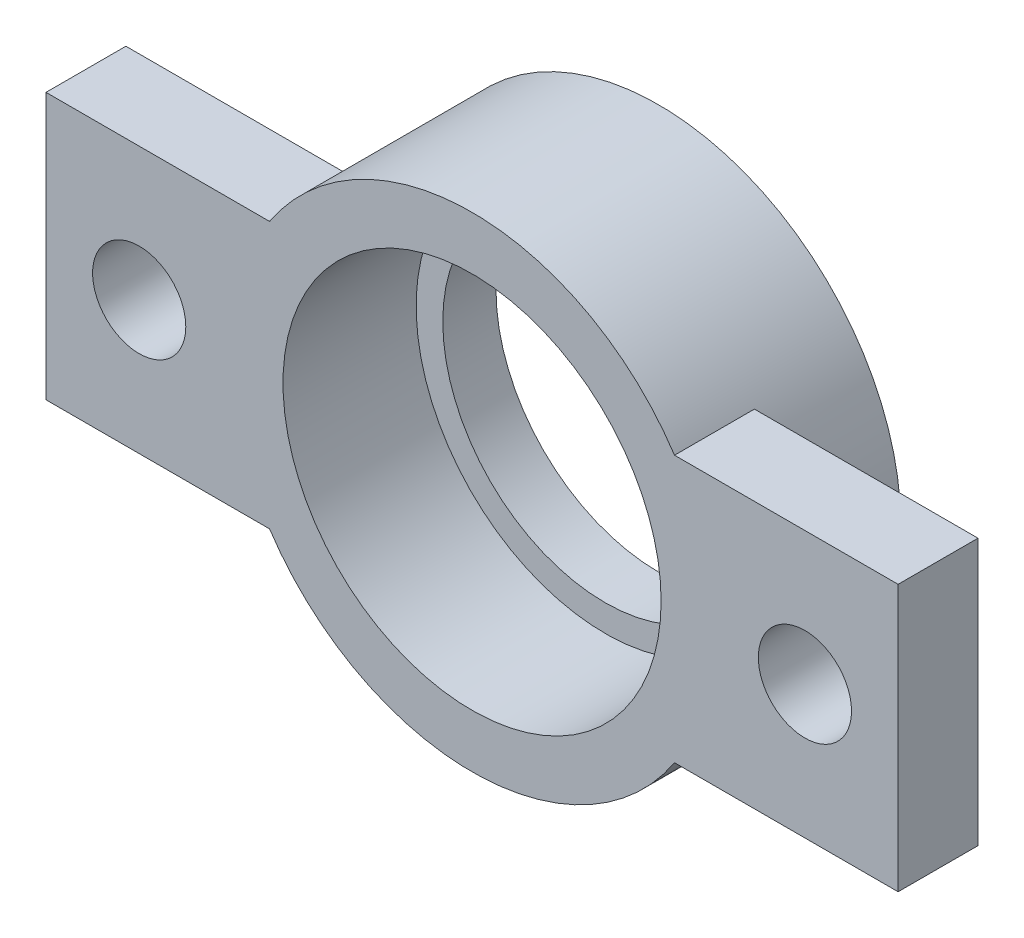
ISO-10303-21;
HEADER;
FILE_DESCRIPTION(('STEP AP214'),'2;1');
FILE_NAME('part.step','',(''),(''),'','','');
FILE_SCHEMA(('AUTOMOTIVE_DESIGN { 1 0 10303 214 1 1 1 1 }'));
ENDSEC;
DATA;
#1=APPLICATION_CONTEXT('core data for automotive mechanical design processes');
#2=APPLICATION_PROTOCOL_DEFINITION('international standard','automotive_design',2000,#1);
#3=PRODUCT_CONTEXT('',#1,'mechanical');
#4=PRODUCT('Part','Part','',(#3));
#5=PRODUCT_RELATED_PRODUCT_CATEGORY('part','',(#4));
#6=PRODUCT_DEFINITION_FORMATION('','',#4);
#7=PRODUCT_DEFINITION_CONTEXT('part definition',#1,'design');
#8=PRODUCT_DEFINITION('design','',#6,#7);
#9=PRODUCT_DEFINITION_SHAPE('','',#8);
#10=(LENGTH_UNIT() NAMED_UNIT(*) SI_UNIT(.MILLI.,.METRE.));
#11=(NAMED_UNIT(*) PLANE_ANGLE_UNIT() SI_UNIT($,.RADIAN.));
#12=(NAMED_UNIT(*) SI_UNIT($,.STERADIAN.) SOLID_ANGLE_UNIT());
#13=UNCERTAINTY_MEASURE_WITH_UNIT(LENGTH_MEASURE(1.E-05),#10,'distance_accuracy_value','');
#14=(GEOMETRIC_REPRESENTATION_CONTEXT(3) GLOBAL_UNCERTAINTY_ASSIGNED_CONTEXT((#13)) GLOBAL_UNIT_ASSIGNED_CONTEXT((#10,
#11,#12)) REPRESENTATION_CONTEXT('',''));
#15=CARTESIAN_POINT('',(0.,0.,0.));
#16=DIRECTION('',(0.,0.,1.));
#17=DIRECTION('',(1.,0.,0.));
#18=AXIS2_PLACEMENT_3D('',#15,#16,#17);
#19=CARTESIAN_POINT('',(0.,0.,0.));
#20=DIRECTION('',(0.,0.,1.));
#21=DIRECTION('',(1.,0.,0.));
#22=AXIS2_PLACEMENT_3D('',#19,#20,#21);
#23=PLANE('',#22);
#24=CARTESIAN_POINT('',(0.,0.,0.));
#25=DIRECTION('',(0.,0.,-1.));
#26=DIRECTION('',(-1.,0.,0.));
#27=AXIS2_PLACEMENT_3D('',#24,#25,#26);
#28=CIRCLE('',#27,9.1);
#29=CARTESIAN_POINT('',(7.60328876210814,5.,0.));
#30=VERTEX_POINT('',#29);
#31=CARTESIAN_POINT('',(7.60328876210814,-5.,0.));
#32=VERTEX_POINT('',#31);
#33=EDGE_CURVE('E46',#30,#32,#28,.T.);
#34=ORIENTED_EDGE('',*,*,#33,.F.);
#35=DIRECTION('',(1.,0.,0.));
#36=VECTOR('',#35,1.);
#37=CARTESIAN_POINT('',(0.,5.,0.));
#38=LINE('',#37,#36);
#39=CARTESIAN_POINT('',(16.,5.,0.));
#40=VERTEX_POINT('',#39);
#41=EDGE_CURVE('E152',#30,#40,#38,.T.);
#42=ORIENTED_EDGE('',*,*,#41,.T.);
#43=DIRECTION('',(0.,1.,0.));
#44=VECTOR('',#43,1.);
#45=CARTESIAN_POINT('',(16.,0.,0.));
#46=LINE('',#45,#44);
#47=CARTESIAN_POINT('',(16.,-5.,0.));
#48=VERTEX_POINT('',#47);
#49=EDGE_CURVE('E148',#48,#40,#46,.T.);
#50=ORIENTED_EDGE('',*,*,#49,.F.);
#51=DIRECTION('',(1.,0.,0.));
#52=VECTOR('',#51,1.);
#53=CARTESIAN_POINT('',(0.,-5.,0.));
#54=LINE('',#53,#52);
#55=EDGE_CURVE('E146',#32,#48,#54,.T.);
#56=ORIENTED_EDGE('',*,*,#55,.F.);
#57=EDGE_LOOP('',(#34,#42,#50,#56));
#58=FACE_BOUND('',#57,.T.);
#59=CARTESIAN_POINT('',(12.5,0.,0.));
#60=DIRECTION('',(0.,0.,1.));
#61=DIRECTION('',(1.,0.,0.));
#62=AXIS2_PLACEMENT_3D('',#59,#60,#61);
#63=CIRCLE('',#62,1.75);
#64=CARTESIAN_POINT('',(14.25,0.,0.));
#65=VERTEX_POINT('',#64);
#66=EDGE_CURVE('E163',#65,#65,#63,.T.);
#67=ORIENTED_EDGE('',*,*,#66,.T.);
#68=EDGE_LOOP('',(#67));
#69=FACE_BOUND('',#68,.T.);
#70=ADVANCED_FACE('F37',(#58,#69),#23,.F.);
#71=CARTESIAN_POINT('',(0.,-5.,3.));
#72=DIRECTION('',(0.,1.,0.));
#73=DIRECTION('',(0.,0.,1.));
#74=AXIS2_PLACEMENT_3D('',#71,#72,#73);
#75=PLANE('',#74);
#76=ORIENTED_EDGE('',*,*,#55,.T.);
#77=DIRECTION('',(0.,0.,-1.));
#78=VECTOR('',#77,1.);
#79=CARTESIAN_POINT('',(16.,-5.,3.));
#80=LINE('',#79,#78);
#81=CARTESIAN_POINT('',(16.,-5.,3.));
#82=VERTEX_POINT('',#81);
#83=EDGE_CURVE('E176',#82,#48,#80,.T.);
#84=ORIENTED_EDGE('',*,*,#83,.F.);
#85=DIRECTION('',(1.,0.,0.));
#86=VECTOR('',#85,1.);
#87=CARTESIAN_POINT('',(0.,-5.,3.));
#88=LINE('',#87,#86);
#89=CARTESIAN_POINT('',(7.60328876210814,-5.,3.));
#90=VERTEX_POINT('',#89);
#91=EDGE_CURVE('E95',#90,#82,#88,.T.);
#92=ORIENTED_EDGE('',*,*,#91,.F.);
#93=DIRECTION('',(0.,0.,-1.));
#94=VECTOR('',#93,1.);
#95=CARTESIAN_POINT('',(7.60328876210814,-5.,3.));
#96=LINE('',#95,#94);
#97=EDGE_CURVE('E178',#90,#32,#96,.T.);
#98=ORIENTED_EDGE('',*,*,#97,.T.);
#99=EDGE_LOOP('',(#76,#84,#92,#98));
#100=FACE_BOUND('',#99,.T.);
#101=ADVANCED_FACE('F39',(#100),#75,.F.);
#102=CARTESIAN_POINT('',(16.,0.,3.));
#103=DIRECTION('',(-1.,0.,0.));
#104=DIRECTION('',(0.,0.,1.));
#105=AXIS2_PLACEMENT_3D('',#102,#103,#104);
#106=PLANE('',#105);
#107=ORIENTED_EDGE('',*,*,#49,.T.);
#108=DIRECTION('',(0.,0.,-1.));
#109=VECTOR('',#108,1.);
#110=CARTESIAN_POINT('',(16.,5.,3.));
#111=LINE('',#110,#109);
#112=CARTESIAN_POINT('',(16.,5.,3.));
#113=VERTEX_POINT('',#112);
#114=EDGE_CURVE('E174',#113,#40,#111,.T.);
#115=ORIENTED_EDGE('',*,*,#114,.F.);
#116=DIRECTION('',(0.,1.,0.));
#117=VECTOR('',#116,1.);
#118=CARTESIAN_POINT('',(16.,0.,3.));
#119=LINE('',#118,#117);
#120=EDGE_CURVE('E188',#82,#113,#119,.T.);
#121=ORIENTED_EDGE('',*,*,#120,.F.);
#122=ORIENTED_EDGE('',*,*,#83,.T.);
#123=EDGE_LOOP('',(#107,#115,#121,#122));
#124=FACE_BOUND('',#123,.T.);
#125=ADVANCED_FACE('F198',(#124),#106,.F.);
#126=CARTESIAN_POINT('',(0.,5.,3.));
#127=DIRECTION('',(0.,1.,0.));
#128=DIRECTION('',(0.,0.,1.));
#129=AXIS2_PLACEMENT_3D('',#126,#127,#128);
#130=PLANE('',#129);
#131=ORIENTED_EDGE('',*,*,#41,.F.);
#132=DIRECTION('',(0.,0.,-1.));
#133=VECTOR('',#132,1.);
#134=CARTESIAN_POINT('',(7.60328876210814,5.,3.));
#135=LINE('',#134,#133);
#136=CARTESIAN_POINT('',(7.60328876210814,5.,3.));
#137=VERTEX_POINT('',#136);
#138=EDGE_CURVE('E171',#137,#30,#135,.T.);
#139=ORIENTED_EDGE('',*,*,#138,.F.);
#140=DIRECTION('',(1.,0.,0.));
#141=VECTOR('',#140,1.);
#142=CARTESIAN_POINT('',(0.,5.,3.));
#143=LINE('',#142,#141);
#144=EDGE_CURVE('E190',#137,#113,#143,.T.);
#145=ORIENTED_EDGE('',*,*,#144,.T.);
#146=ORIENTED_EDGE('',*,*,#114,.T.);
#147=EDGE_LOOP('',(#131,#139,#145,#146));
#148=FACE_BOUND('',#147,.T.);
#149=ADVANCED_FACE('F194',(#148),#130,.T.);
#150=CARTESIAN_POINT('',(0.,0.,3.));
#151=DIRECTION('',(0.,0.,-1.));
#152=DIRECTION('',(-1.,0.,0.));
#153=AXIS2_PLACEMENT_3D('',#150,#151,#152);
#154=CYLINDRICAL_SURFACE('',#153,9.1);
#155=ORIENTED_EDGE('',*,*,#138,.T.);
#156=ORIENTED_EDGE('',*,*,#33,.T.);
#157=ORIENTED_EDGE('',*,*,#97,.F.);
#158=CARTESIAN_POINT('',(0.,0.,3.));
#159=DIRECTION('',(0.,0.,1.));
#160=DIRECTION('',(1.,0.,0.));
#161=AXIS2_PLACEMENT_3D('',#158,#159,#160);
#162=CIRCLE('',#161,9.1);
#163=CARTESIAN_POINT('',(-7.60328876210814,-5.,3.));
#164=VERTEX_POINT('',#163);
#165=EDGE_CURVE('E166',#164,#90,#162,.T.);
#166=ORIENTED_EDGE('',*,*,#165,.F.);
#167=DIRECTION('',(0.,0.,-1.));
#168=VECTOR('',#167,1.);
#169=CARTESIAN_POINT('',(-7.60328876210814,-5.,3.));
#170=LINE('',#169,#168);
#171=CARTESIAN_POINT('',(-7.60328876210814,-5.,0.));
#172=VERTEX_POINT('',#171);
#173=EDGE_CURVE('E145',#164,#172,#170,.T.);
#174=ORIENTED_EDGE('',*,*,#173,.T.);
#175=CARTESIAN_POINT('',(-7.60328876210814,5.,0.));
#176=VERTEX_POINT('',#175);
#177=EDGE_CURVE('E87',#172,#176,#28,.T.);
#178=ORIENTED_EDGE('',*,*,#177,.T.);
#179=DIRECTION('',(0.,0.,-1.));
#180=VECTOR('',#179,1.);
#181=CARTESIAN_POINT('',(-7.60328876210814,5.,3.));
#182=LINE('',#181,#180);
#183=CARTESIAN_POINT('',(-7.60328876210814,5.,3.));
#184=VERTEX_POINT('',#183);
#185=EDGE_CURVE('E121',#184,#176,#182,.T.);
#186=ORIENTED_EDGE('',*,*,#185,.F.);
#187=CARTESIAN_POINT('',(0.,0.,3.));
#188=DIRECTION('',(0.,0.,1.));
#189=DIRECTION('',(1.,0.,0.));
#190=AXIS2_PLACEMENT_3D('',#187,#188,#189);
#191=CIRCLE('',#190,9.1);
#192=EDGE_CURVE('E128',#137,#184,#191,.T.);
#193=ORIENTED_EDGE('',*,*,#192,.F.);
#194=EDGE_LOOP('',(#155,#156,#157,#166,#174,#178,#186,#193));
#195=FACE_BOUND('',#194,.T.);
#196=CARTESIAN_POINT('',(0.,0.,-4.));
#197=DIRECTION('',(0.,0.,-1.));
#198=DIRECTION('',(-1.,0.,0.));
#199=AXIS2_PLACEMENT_3D('',#196,#197,#198);
#200=CIRCLE('',#199,9.1);
#201=CARTESIAN_POINT('',(-9.1,0.,-4.));
#202=VERTEX_POINT('',#201);
#203=EDGE_CURVE('E149',#202,#202,#200,.T.);
#204=ORIENTED_EDGE('',*,*,#203,.F.);
#205=EDGE_LOOP('',(#204));
#206=FACE_BOUND('',#205,.T.);
#207=ADVANCED_FACE('F202',(#195,#206),#154,.T.);
#208=CARTESIAN_POINT('',(0.,5.,3.));
#209=DIRECTION('',(0.,1.,0.));
#210=DIRECTION('',(0.,0.,1.));
#211=AXIS2_PLACEMENT_3D('',#208,#209,#210);
#212=PLANE('',#211);
#213=DIRECTION('',(1.,0.,0.));
#214=VECTOR('',#213,1.);
#215=CARTESIAN_POINT('',(0.,5.,0.));
#216=LINE('',#215,#214);
#217=CARTESIAN_POINT('',(-16.,5.,0.));
#218=VERTEX_POINT('',#217);
#219=EDGE_CURVE('E116',#218,#176,#216,.T.);
#220=ORIENTED_EDGE('',*,*,#219,.F.);
#221=DIRECTION('',(0.,0.,-1.));
#222=VECTOR('',#221,1.);
#223=CARTESIAN_POINT('',(-16.,5.,3.));
#224=LINE('',#223,#222);
#225=CARTESIAN_POINT('',(-16.,5.,3.));
#226=VERTEX_POINT('',#225);
#227=EDGE_CURVE('E111',#226,#218,#224,.T.);
#228=ORIENTED_EDGE('',*,*,#227,.F.);
#229=DIRECTION('',(1.,0.,0.));
#230=VECTOR('',#229,1.);
#231=CARTESIAN_POINT('',(0.,5.,3.));
#232=LINE('',#231,#230);
#233=EDGE_CURVE('E115',#226,#184,#232,.T.);
#234=ORIENTED_EDGE('',*,*,#233,.T.);
#235=ORIENTED_EDGE('',*,*,#185,.T.);
#236=EDGE_LOOP('',(#220,#228,#234,#235));
#237=FACE_BOUND('',#236,.T.);
#238=ADVANCED_FACE('F113',(#237),#212,.T.);
#239=CARTESIAN_POINT('',(-16.,0.,3.));
#240=DIRECTION('',(-1.,0.,0.));
#241=DIRECTION('',(0.,0.,1.));
#242=AXIS2_PLACEMENT_3D('',#239,#240,#241);
#243=PLANE('',#242);
#244=DIRECTION('',(0.,1.,0.));
#245=VECTOR('',#244,1.);
#246=CARTESIAN_POINT('',(-16.,0.,0.));
#247=LINE('',#246,#245);
#248=CARTESIAN_POINT('',(-16.,-5.,0.));
#249=VERTEX_POINT('',#248);
#250=EDGE_CURVE('E156',#249,#218,#247,.T.);
#251=ORIENTED_EDGE('',*,*,#250,.F.);
#252=DIRECTION('',(0.,0.,-1.));
#253=VECTOR('',#252,1.);
#254=CARTESIAN_POINT('',(-16.,-5.,3.));
#255=LINE('',#254,#253);
#256=CARTESIAN_POINT('',(-16.,-5.,3.));
#257=VERTEX_POINT('',#256);
#258=EDGE_CURVE('E80',#257,#249,#255,.T.);
#259=ORIENTED_EDGE('',*,*,#258,.F.);
#260=DIRECTION('',(0.,1.,0.));
#261=VECTOR('',#260,1.);
#262=CARTESIAN_POINT('',(-16.,0.,3.));
#263=LINE('',#262,#261);
#264=EDGE_CURVE('E125',#257,#226,#263,.T.);
#265=ORIENTED_EDGE('',*,*,#264,.T.);
#266=ORIENTED_EDGE('',*,*,#227,.T.);
#267=EDGE_LOOP('',(#251,#259,#265,#266));
#268=FACE_BOUND('',#267,.T.);
#269=ADVANCED_FACE('F131',(#268),#243,.T.);
#270=CARTESIAN_POINT('',(-12.5,0.,3.));
#271=DIRECTION('',(0.,0.,-1.));
#272=DIRECTION('',(-1.,0.,0.));
#273=AXIS2_PLACEMENT_3D('',#270,#271,#272);
#274=CYLINDRICAL_SURFACE('',#273,1.75);
#275=CARTESIAN_POINT('',(-12.5,0.,3.));
#276=DIRECTION('',(0.,0.,1.));
#277=DIRECTION('',(1.,0.,0.));
#278=AXIS2_PLACEMENT_3D('',#275,#276,#277);
#279=CIRCLE('',#278,1.75);
#280=CARTESIAN_POINT('',(-10.75,0.,3.));
#281=VERTEX_POINT('',#280);
#282=EDGE_CURVE('E139',#281,#281,#279,.F.);
#283=ORIENTED_EDGE('',*,*,#282,.F.);
#284=EDGE_LOOP('',(#283));
#285=FACE_BOUND('',#284,.T.);
#286=CARTESIAN_POINT('',(-12.5,0.,0.));
#287=DIRECTION('',(0.,0.,1.));
#288=DIRECTION('',(1.,0.,0.));
#289=AXIS2_PLACEMENT_3D('',#286,#287,#288);
#290=CIRCLE('',#289,1.75);
#291=CARTESIAN_POINT('',(-10.75,0.,0.));
#292=VERTEX_POINT('',#291);
#293=EDGE_CURVE('E160',#292,#292,#290,.F.);
#294=ORIENTED_EDGE('',*,*,#293,.T.);
#295=EDGE_LOOP('',(#294));
#296=FACE_BOUND('',#295,.T.);
#297=ADVANCED_FACE('F218',(#285,#296),#274,.F.);
#298=CARTESIAN_POINT('',(0.,0.,3.));
#299=DIRECTION('',(0.,0.,-1.));
#300=DIRECTION('',(-1.,0.,0.));
#301=AXIS2_PLACEMENT_3D('',#298,#299,#300);
#302=CYLINDRICAL_SURFACE('',#301,7.1);
#303=CARTESIAN_POINT('',(0.,0.,-2.));
#304=DIRECTION('',(0.,0.,1.));
#305=DIRECTION('',(1.,0.,0.));
#306=AXIS2_PLACEMENT_3D('',#303,#304,#305);
#307=CIRCLE('',#306,7.1);
#308=CARTESIAN_POINT('',(7.1,0.,-2.));
#309=VERTEX_POINT('',#308);
#310=EDGE_CURVE('E11',#309,#309,#307,.T.);
#311=ORIENTED_EDGE('',*,*,#310,.F.);
#312=EDGE_LOOP('',(#311));
#313=FACE_BOUND('',#312,.T.);
#314=CARTESIAN_POINT('',(0.,0.,3.));
#315=DIRECTION('',(0.,0.,1.));
#316=DIRECTION('',(1.,0.,0.));
#317=AXIS2_PLACEMENT_3D('',#314,#315,#316);
#318=CIRCLE('',#317,7.1);
#319=CARTESIAN_POINT('',(7.1,0.,3.));
#320=VERTEX_POINT('',#319);
#321=EDGE_CURVE('E133',#320,#320,#318,.T.);
#322=ORIENTED_EDGE('',*,*,#321,.T.);
#323=EDGE_LOOP('',(#322));
#324=FACE_BOUND('',#323,.T.);
#325=ADVANCED_FACE('F210',(#313,#324),#302,.F.);
#326=CARTESIAN_POINT('',(0.,-5.,3.));
#327=DIRECTION('',(0.,1.,0.));
#328=DIRECTION('',(0.,0.,1.));
#329=AXIS2_PLACEMENT_3D('',#326,#327,#328);
#330=PLANE('',#329);
#331=DIRECTION('',(1.,0.,0.));
#332=VECTOR('',#331,1.);
#333=CARTESIAN_POINT('',(0.,-5.,0.));
#334=LINE('',#333,#332);
#335=EDGE_CURVE('E158',#249,#172,#334,.T.);
#336=ORIENTED_EDGE('',*,*,#335,.T.);
#337=ORIENTED_EDGE('',*,*,#173,.F.);
#338=DIRECTION('',(1.,0.,0.));
#339=VECTOR('',#338,1.);
#340=CARTESIAN_POINT('',(0.,-5.,3.));
#341=LINE('',#340,#339);
#342=EDGE_CURVE('E54',#257,#164,#341,.T.);
#343=ORIENTED_EDGE('',*,*,#342,.F.);
#344=ORIENTED_EDGE('',*,*,#258,.T.);
#345=EDGE_LOOP('',(#336,#337,#343,#344));
#346=FACE_BOUND('',#345,.T.);
#347=ADVANCED_FACE('F206',(#346),#330,.F.);
#348=CARTESIAN_POINT('',(12.5,0.,3.));
#349=DIRECTION('',(0.,0.,-1.));
#350=DIRECTION('',(-1.,0.,0.));
#351=AXIS2_PLACEMENT_3D('',#348,#349,#350);
#352=CYLINDRICAL_SURFACE('',#351,1.75);
#353=CARTESIAN_POINT('',(12.5,0.,3.));
#354=DIRECTION('',(0.,0.,1.));
#355=DIRECTION('',(1.,0.,0.));
#356=AXIS2_PLACEMENT_3D('',#353,#354,#355);
#357=CIRCLE('',#356,1.75);
#358=CARTESIAN_POINT('',(14.25,0.,3.));
#359=VERTEX_POINT('',#358);
#360=EDGE_CURVE('E142',#359,#359,#357,.T.);
#361=ORIENTED_EDGE('',*,*,#360,.T.);
#362=EDGE_LOOP('',(#361));
#363=FACE_BOUND('',#362,.T.);
#364=ORIENTED_EDGE('',*,*,#66,.F.);
#365=EDGE_LOOP('',(#364));
#366=FACE_BOUND('',#365,.T.);
#367=ADVANCED_FACE('F209',(#363,#366),#352,.F.);
#368=CARTESIAN_POINT('',(0.,0.,3.));
#369=DIRECTION('',(0.,0.,1.));
#370=DIRECTION('',(1.,0.,0.));
#371=AXIS2_PLACEMENT_3D('',#368,#369,#370);
#372=PLANE('',#371);
#373=ORIENTED_EDGE('',*,*,#165,.T.);
#374=ORIENTED_EDGE('',*,*,#91,.T.);
#375=ORIENTED_EDGE('',*,*,#120,.T.);
#376=ORIENTED_EDGE('',*,*,#144,.F.);
#377=ORIENTED_EDGE('',*,*,#192,.T.);
#378=ORIENTED_EDGE('',*,*,#233,.F.);
#379=ORIENTED_EDGE('',*,*,#264,.F.);
#380=ORIENTED_EDGE('',*,*,#342,.T.);
#381=EDGE_LOOP('',(#373,#374,#375,#376,#377,#378,#379,#380));
#382=FACE_BOUND('',#381,.T.);
#383=ORIENTED_EDGE('',*,*,#321,.F.);
#384=EDGE_LOOP('',(#383));
#385=FACE_BOUND('',#384,.T.);
#386=ORIENTED_EDGE('',*,*,#282,.T.);
#387=EDGE_LOOP('',(#386));
#388=FACE_BOUND('',#387,.T.);
#389=ORIENTED_EDGE('',*,*,#360,.F.);
#390=EDGE_LOOP('',(#389));
#391=FACE_BOUND('',#390,.T.);
#392=ADVANCED_FACE('F123',(#382,#385,#388,#391),#372,.T.);
#393=ORIENTED_EDGE('',*,*,#177,.F.);
#394=ORIENTED_EDGE('',*,*,#335,.F.);
#395=ORIENTED_EDGE('',*,*,#250,.T.);
#396=ORIENTED_EDGE('',*,*,#219,.T.);
#397=EDGE_LOOP('',(#393,#394,#395,#396));
#398=FACE_BOUND('',#397,.T.);
#399=ORIENTED_EDGE('',*,*,#293,.F.);
#400=EDGE_LOOP('',(#399));
#401=FACE_BOUND('',#400,.T.);
#402=ADVANCED_FACE('F204',(#398,#401),#23,.F.);
#403=CARTESIAN_POINT('',(0.,0.,-4.));
#404=DIRECTION('',(0.,0.,-1.));
#405=DIRECTION('',(-1.,0.,0.));
#406=AXIS2_PLACEMENT_3D('',#403,#404,#405);
#407=PLANE('',#406);
#408=ORIENTED_EDGE('',*,*,#203,.T.);
#409=EDGE_LOOP('',(#408));
#410=FACE_BOUND('',#409,.T.);
#411=CARTESIAN_POINT('',(0.,0.,-4.));
#412=DIRECTION('',(0.,0.,1.));
#413=DIRECTION('',(1.,0.,0.));
#414=AXIS2_PLACEMENT_3D('',#411,#412,#413);
#415=CIRCLE('',#414,6.1);
#416=CARTESIAN_POINT('',(6.1,0.,-4.));
#417=VERTEX_POINT('',#416);
#418=EDGE_CURVE('E254',#417,#417,#415,.T.);
#419=ORIENTED_EDGE('',*,*,#418,.T.);
#420=EDGE_LOOP('',(#419));
#421=FACE_BOUND('',#420,.T.);
#422=ADVANCED_FACE('F229',(#410,#421),#407,.T.);
#423=CARTESIAN_POINT('',(0.,0.,-2.));
#424=DIRECTION('',(0.,0.,1.));
#425=DIRECTION('',(1.,0.,0.));
#426=AXIS2_PLACEMENT_3D('',#423,#424,#425);
#427=PLANE('',#426);
#428=ORIENTED_EDGE('',*,*,#310,.T.);
#429=EDGE_LOOP('',(#428));
#430=FACE_BOUND('',#429,.T.);
#431=CARTESIAN_POINT('',(0.,0.,-2.));
#432=DIRECTION('',(0.,0.,1.));
#433=DIRECTION('',(1.,0.,0.));
#434=AXIS2_PLACEMENT_3D('',#431,#432,#433);
#435=CIRCLE('',#434,6.1);
#436=CARTESIAN_POINT('',(6.1,0.,-2.));
#437=VERTEX_POINT('',#436);
#438=EDGE_CURVE('E251',#437,#437,#435,.T.);
#439=ORIENTED_EDGE('',*,*,#438,.F.);
#440=EDGE_LOOP('',(#439));
#441=FACE_BOUND('',#440,.T.);
#442=ADVANCED_FACE('F234',(#430,#441),#427,.T.);
#443=CARTESIAN_POINT('',(0.,0.,-2.));
#444=DIRECTION('',(0.,0.,-1.));
#445=DIRECTION('',(-1.,0.,0.));
#446=AXIS2_PLACEMENT_3D('',#443,#444,#445);
#447=CYLINDRICAL_SURFACE('',#446,6.1);
#448=ORIENTED_EDGE('',*,*,#438,.T.);
#449=EDGE_LOOP('',(#448));
#450=FACE_BOUND('',#449,.T.);
#451=ORIENTED_EDGE('',*,*,#418,.F.);
#452=EDGE_LOOP('',(#451));
#453=FACE_BOUND('',#452,.T.);
#454=ADVANCED_FACE('F242',(#450,#453),#447,.F.);
#455=CLOSED_SHELL('',(#70,#101,#125,#149,#207,#238,#269,#297,#325,#347,#367,#392,#402,#422,#442,#454));
#456=MANIFOLD_SOLID_BREP('B2',#455);
#457=ADVANCED_BREP_SHAPE_REPRESENTATION('',(#18,#456),#14);
#458=SHAPE_DEFINITION_REPRESENTATION(#9,#457);
ENDSEC;
END-ISO-10303-21;
